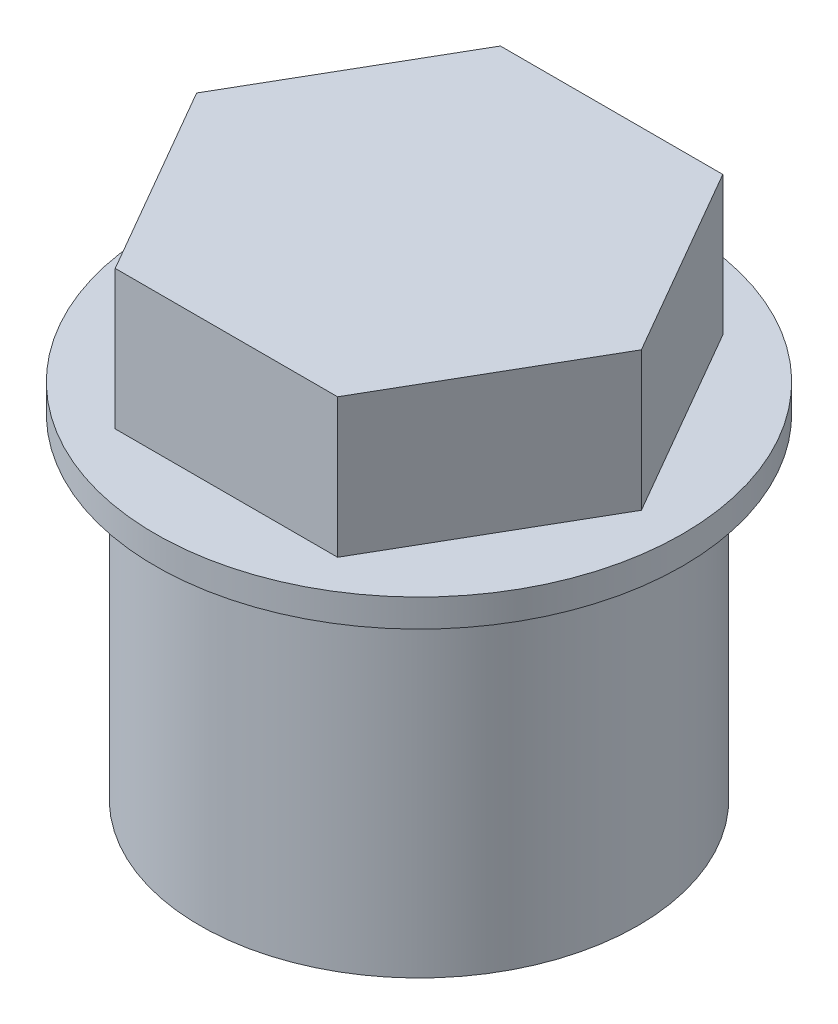
ISO-10303-21;
HEADER;
FILE_DESCRIPTION(('STEP AP214'),'2;1');
FILE_NAME('part.step','',(''),(''),'','','');
FILE_SCHEMA(('AUTOMOTIVE_DESIGN { 1 0 10303 214 1 1 1 1 }'));
ENDSEC;
DATA;
#1=APPLICATION_CONTEXT('core data for automotive mechanical design processes');
#2=APPLICATION_PROTOCOL_DEFINITION('international standard','automotive_design',2000,#1);
#3=PRODUCT_CONTEXT('',#1,'mechanical');
#4=PRODUCT('Part','Part','',(#3));
#5=PRODUCT_RELATED_PRODUCT_CATEGORY('part','',(#4));
#6=PRODUCT_DEFINITION_FORMATION('','',#4);
#7=PRODUCT_DEFINITION_CONTEXT('part definition',#1,'design');
#8=PRODUCT_DEFINITION('design','',#6,#7);
#9=PRODUCT_DEFINITION_SHAPE('','',#8);
#10=(LENGTH_UNIT() NAMED_UNIT(*) SI_UNIT(.MILLI.,.METRE.));
#11=(NAMED_UNIT(*) PLANE_ANGLE_UNIT() SI_UNIT($,.RADIAN.));
#12=(NAMED_UNIT(*) SI_UNIT($,.STERADIAN.) SOLID_ANGLE_UNIT());
#13=UNCERTAINTY_MEASURE_WITH_UNIT(LENGTH_MEASURE(1.E-05),#10,'distance_accuracy_value','');
#14=(GEOMETRIC_REPRESENTATION_CONTEXT(3) GLOBAL_UNCERTAINTY_ASSIGNED_CONTEXT((#13)) GLOBAL_UNIT_ASSIGNED_CONTEXT((#10,
#11,#12)) REPRESENTATION_CONTEXT('',''));
#15=CARTESIAN_POINT('',(0.,0.,0.));
#16=DIRECTION('',(0.,0.,1.));
#17=DIRECTION('',(1.,0.,0.));
#18=AXIS2_PLACEMENT_3D('',#15,#16,#17);
#19=CARTESIAN_POINT('',(10.16,22.86,0.));
#20=DIRECTION('',(0.,1.,0.));
#21=DIRECTION('',(-1.,0.,0.));
#22=AXIS2_PLACEMENT_3D('',#19,#20,#21);
#23=PLANE('',#22);
#24=DIRECTION('',(0.500000000000001,0.,0.866025403784438));
#25=VECTOR('',#24,1.);
#26=CARTESIAN_POINT('',(-7.62,22.86,4.39940905122495));
#27=LINE('',#26,#25);
#28=CARTESIAN_POINT('',(-10.16,22.86,0.));
#29=VERTEX_POINT('',#28);
#30=CARTESIAN_POINT('',(-5.08,22.86,8.7988181024499));
#31=VERTEX_POINT('',#30);
#32=EDGE_CURVE('E101',#29,#31,#27,.T.);
#33=ORIENTED_EDGE('',*,*,#32,.T.);
#34=DIRECTION('',(1.,0.,0.));
#35=VECTOR('',#34,1.);
#36=CARTESIAN_POINT('',(0.,22.86,8.7988181024499));
#37=LINE('',#36,#35);
#38=CARTESIAN_POINT('',(5.08,22.86,8.7988181024499));
#39=VERTEX_POINT('',#38);
#40=EDGE_CURVE('E86',#31,#39,#37,.T.);
#41=ORIENTED_EDGE('',*,*,#40,.T.);
#42=DIRECTION('',(0.5,0.,-0.866025403784439));
#43=VECTOR('',#42,1.);
#44=CARTESIAN_POINT('',(7.62000000000001,22.86,4.39940905122494));
#45=LINE('',#44,#43);
#46=CARTESIAN_POINT('',(10.16,22.86,0.));
#47=VERTEX_POINT('',#46);
#48=EDGE_CURVE('E252',#39,#47,#45,.T.);
#49=ORIENTED_EDGE('',*,*,#48,.T.);
#50=DIRECTION('',(-0.5,0.,-0.866025403784439));
#51=VECTOR('',#50,1.);
#52=CARTESIAN_POINT('',(7.62,22.86,-4.39940905122495));
#53=LINE('',#52,#51);
#54=CARTESIAN_POINT('',(5.08,22.86,-8.7988181024499));
#55=VERTEX_POINT('',#54);
#56=EDGE_CURVE('E247',#47,#55,#53,.T.);
#57=ORIENTED_EDGE('',*,*,#56,.T.);
#58=DIRECTION('',(-1.,0.,0.));
#59=VECTOR('',#58,1.);
#60=CARTESIAN_POINT('',(0.,22.86,-8.7988181024499));
#61=LINE('',#60,#59);
#62=CARTESIAN_POINT('',(-5.08000000000001,22.86,-8.79881810244989));
#63=VERTEX_POINT('',#62);
#64=EDGE_CURVE('E116',#55,#63,#61,.T.);
#65=ORIENTED_EDGE('',*,*,#64,.T.);
#66=DIRECTION('',(-0.5,0.,0.866025403784439));
#67=VECTOR('',#66,1.);
#68=CARTESIAN_POINT('',(-7.62,22.86,-4.39940905122495));
#69=LINE('',#68,#67);
#70=EDGE_CURVE('E57',#63,#29,#69,.T.);
#71=ORIENTED_EDGE('',*,*,#70,.T.);
#72=EDGE_LOOP('',(#33,#41,#49,#57,#65,#71));
#73=FACE_BOUND('',#72,.T.);
#74=ADVANCED_FACE('F34',(#73),#23,.T.);
#75=CARTESIAN_POINT('',(10.0076,0.,0.));
#76=DIRECTION('',(0.,-1.,0.));
#77=DIRECTION('',(1.,0.,0.));
#78=AXIS2_PLACEMENT_3D('',#75,#76,#77);
#79=PLANE('',#78);
#80=CARTESIAN_POINT('',(0.,0.,0.));
#81=DIRECTION('',(0.,-1.,0.));
#82=DIRECTION('',(1.,0.,0.));
#83=AXIS2_PLACEMENT_3D('',#80,#81,#82);
#84=CIRCLE('',#83,10.0076);
#85=CARTESIAN_POINT('',(10.0076,0.,0.));
#86=VERTEX_POINT('',#85);
#87=EDGE_CURVE('E120',#86,#86,#84,.T.);
#88=ORIENTED_EDGE('',*,*,#87,.T.);
#89=EDGE_LOOP('',(#88));
#90=FACE_BOUND('',#89,.T.);
#91=ADVANCED_FACE('F36',(#90),#79,.T.);
#92=CARTESIAN_POINT('',(12.0396,16.51,0.));
#93=DIRECTION('',(0.,1.,0.));
#94=DIRECTION('',(-1.,0.,0.));
#95=AXIS2_PLACEMENT_3D('',#92,#93,#94);
#96=PLANE('',#95);
#97=DIRECTION('',(1.,0.,0.));
#98=VECTOR('',#97,1.);
#99=CARTESIAN_POINT('',(0.,16.51,-8.7988181024499));
#100=LINE('',#99,#98);
#101=CARTESIAN_POINT('',(-5.08000000000001,16.51,-8.79881810244989));
#102=VERTEX_POINT('',#101);
#103=CARTESIAN_POINT('',(5.08,16.51,-8.7988181024499));
#104=VERTEX_POINT('',#103);
#105=EDGE_CURVE('E107',#102,#104,#100,.T.);
#106=ORIENTED_EDGE('',*,*,#105,.T.);
#107=DIRECTION('',(0.5,0.,0.866025403784439));
#108=VECTOR('',#107,1.);
#109=CARTESIAN_POINT('',(7.62,16.51,-4.39940905122495));
#110=LINE('',#109,#108);
#111=CARTESIAN_POINT('',(10.16,16.51,0.));
#112=VERTEX_POINT('',#111);
#113=EDGE_CURVE('E249',#104,#112,#110,.T.);
#114=ORIENTED_EDGE('',*,*,#113,.T.);
#115=DIRECTION('',(-0.5,0.,0.866025403784439));
#116=VECTOR('',#115,1.);
#117=CARTESIAN_POINT('',(7.62,16.51,4.39940905122494));
#118=LINE('',#117,#116);
#119=CARTESIAN_POINT('',(5.08,16.51,8.7988181024499));
#120=VERTEX_POINT('',#119);
#121=EDGE_CURVE('E118',#112,#120,#118,.T.);
#122=ORIENTED_EDGE('',*,*,#121,.T.);
#123=DIRECTION('',(-1.,0.,0.));
#124=VECTOR('',#123,1.);
#125=CARTESIAN_POINT('',(0.,16.51,8.7988181024499));
#126=LINE('',#125,#124);
#127=CARTESIAN_POINT('',(-5.08,16.51,8.7988181024499));
#128=VERTEX_POINT('',#127);
#129=EDGE_CURVE('E49',#120,#128,#126,.T.);
#130=ORIENTED_EDGE('',*,*,#129,.T.);
#131=DIRECTION('',(-0.500000000000001,0.,-0.866025403784438));
#132=VECTOR('',#131,1.);
#133=CARTESIAN_POINT('',(-7.62,16.51,4.39940905122495));
#134=LINE('',#133,#132);
#135=CARTESIAN_POINT('',(-10.16,16.51,0.));
#136=VERTEX_POINT('',#135);
#137=EDGE_CURVE('E103',#128,#136,#134,.T.);
#138=ORIENTED_EDGE('',*,*,#137,.T.);
#139=DIRECTION('',(0.5,0.,-0.866025403784439));
#140=VECTOR('',#139,1.);
#141=CARTESIAN_POINT('',(-7.62000000000001,16.51,-4.39940905122495));
#142=LINE('',#141,#140);
#143=EDGE_CURVE('E256',#136,#102,#142,.T.);
#144=ORIENTED_EDGE('',*,*,#143,.T.);
#145=EDGE_LOOP('',(#106,#114,#122,#130,#138,#144));
#146=FACE_BOUND('',#145,.T.);
#147=CARTESIAN_POINT('',(0.,16.51,0.));
#148=DIRECTION('',(0.,-1.,0.));
#149=DIRECTION('',(1.,0.,0.));
#150=AXIS2_PLACEMENT_3D('',#147,#148,#149);
#151=CIRCLE('',#150,12.0396);
#152=CARTESIAN_POINT('',(12.0396,16.51,0.));
#153=VERTEX_POINT('',#152);
#154=EDGE_CURVE('E11',#153,#153,#151,.T.);
#155=ORIENTED_EDGE('',*,*,#154,.F.);
#156=EDGE_LOOP('',(#155));
#157=FACE_BOUND('',#156,.T.);
#158=ADVANCED_FACE('F133',(#146,#157),#96,.T.);
#159=CARTESIAN_POINT('',(0.,0.,0.));
#160=DIRECTION('',(0.,-1.,0.));
#161=DIRECTION('',(1.,0.,0.));
#162=AXIS2_PLACEMENT_3D('',#159,#160,#161);
#163=CYLINDRICAL_SURFACE('',#162,12.0396);
#164=ORIENTED_EDGE('',*,*,#154,.T.);
#165=EDGE_LOOP('',(#164));
#166=FACE_BOUND('',#165,.T.);
#167=CARTESIAN_POINT('',(0.,15.24,0.));
#168=DIRECTION('',(0.,-1.,0.));
#169=DIRECTION('',(1.,0.,0.));
#170=AXIS2_PLACEMENT_3D('',#167,#168,#169);
#171=CIRCLE('',#170,12.0396);
#172=CARTESIAN_POINT('',(12.0396,15.24,0.));
#173=VERTEX_POINT('',#172);
#174=EDGE_CURVE('E42',#173,#173,#171,.T.);
#175=ORIENTED_EDGE('',*,*,#174,.F.);
#176=EDGE_LOOP('',(#175));
#177=FACE_BOUND('',#176,.T.);
#178=ADVANCED_FACE('F131',(#166,#177),#163,.T.);
#179=CARTESIAN_POINT('',(12.0396,15.24,0.));
#180=DIRECTION('',(0.,-1.,0.));
#181=DIRECTION('',(1.,0.,0.));
#182=AXIS2_PLACEMENT_3D('',#179,#180,#181);
#183=PLANE('',#182);
#184=ORIENTED_EDGE('',*,*,#174,.T.);
#185=EDGE_LOOP('',(#184));
#186=FACE_BOUND('',#185,.T.);
#187=CARTESIAN_POINT('',(0.,15.24,0.));
#188=DIRECTION('',(0.,-1.,0.));
#189=DIRECTION('',(1.,0.,0.));
#190=AXIS2_PLACEMENT_3D('',#187,#188,#189);
#191=CIRCLE('',#190,10.0076);
#192=CARTESIAN_POINT('',(10.0076,15.24,0.));
#193=VERTEX_POINT('',#192);
#194=EDGE_CURVE('E123',#193,#193,#191,.T.);
#195=ORIENTED_EDGE('',*,*,#194,.F.);
#196=EDGE_LOOP('',(#195));
#197=FACE_BOUND('',#196,.T.);
#198=ADVANCED_FACE('F128',(#186,#197),#183,.T.);
#199=CARTESIAN_POINT('',(0.,0.,0.));
#200=DIRECTION('',(0.,-1.,0.));
#201=DIRECTION('',(1.,0.,0.));
#202=AXIS2_PLACEMENT_3D('',#199,#200,#201);
#203=CYLINDRICAL_SURFACE('',#202,10.0076);
#204=ORIENTED_EDGE('',*,*,#194,.T.);
#205=EDGE_LOOP('',(#204));
#206=FACE_BOUND('',#205,.T.);
#207=ORIENTED_EDGE('',*,*,#87,.F.);
#208=EDGE_LOOP('',(#207));
#209=FACE_BOUND('',#208,.T.);
#210=ADVANCED_FACE('F140',(#206,#209),#203,.T.);
#211=CARTESIAN_POINT('',(-7.62,6.25922363144047,4.39940905122495));
#212=DIRECTION('',(-0.866025403784438,0.,0.500000000000001));
#213=DIRECTION('',(0.500000000000001,0.,0.866025403784438));
#214=AXIS2_PLACEMENT_3D('',#211,#212,#213);
#215=PLANE('',#214);
#216=DIRECTION('',(0.,1.,0.));
#217=VECTOR('',#216,1.);
#218=CARTESIAN_POINT('',(-5.08,6.25922363144047,8.7988181024499));
#219=LINE('',#218,#217);
#220=EDGE_CURVE('E89',#128,#31,#219,.T.);
#221=ORIENTED_EDGE('',*,*,#220,.T.);
#222=ORIENTED_EDGE('',*,*,#32,.F.);
#223=DIRECTION('',(0.,1.,0.));
#224=VECTOR('',#223,1.);
#225=CARTESIAN_POINT('',(-10.16,6.25922363144047,0.));
#226=LINE('',#225,#224);
#227=EDGE_CURVE('E104',#136,#29,#226,.T.);
#228=ORIENTED_EDGE('',*,*,#227,.F.);
#229=ORIENTED_EDGE('',*,*,#137,.F.);
#230=EDGE_LOOP('',(#221,#222,#228,#229));
#231=FACE_BOUND('',#230,.T.);
#232=ADVANCED_FACE('F99',(#231),#215,.T.);
#233=CARTESIAN_POINT('',(0.,6.25922363144047,-8.7988181024499));
#234=DIRECTION('',(0.,0.,-1.));
#235=DIRECTION('',(-1.,0.,0.));
#236=AXIS2_PLACEMENT_3D('',#233,#234,#235);
#237=PLANE('',#236);
#238=DIRECTION('',(0.,1.,0.));
#239=VECTOR('',#238,1.);
#240=CARTESIAN_POINT('',(-5.08000000000001,6.25922363144047,-8.79881810244989));
#241=LINE('',#240,#239);
#242=EDGE_CURVE('E255',#102,#63,#241,.T.);
#243=ORIENTED_EDGE('',*,*,#242,.T.);
#244=ORIENTED_EDGE('',*,*,#64,.F.);
#245=DIRECTION('',(0.,1.,0.));
#246=VECTOR('',#245,1.);
#247=CARTESIAN_POINT('',(5.08,6.25922363144047,-8.7988181024499));
#248=LINE('',#247,#246);
#249=EDGE_CURVE('E111',#104,#55,#248,.T.);
#250=ORIENTED_EDGE('',*,*,#249,.F.);
#251=ORIENTED_EDGE('',*,*,#105,.F.);
#252=EDGE_LOOP('',(#243,#244,#250,#251));
#253=FACE_BOUND('',#252,.T.);
#254=ADVANCED_FACE('F159',(#253),#237,.T.);
#255=CARTESIAN_POINT('',(7.62,6.25922363144047,4.39940905122494));
#256=DIRECTION('',(0.866025403784439,0.,0.499999999999999));
#257=DIRECTION('',(0.5,0.,-0.866025403784439));
#258=AXIS2_PLACEMENT_3D('',#255,#256,#257);
#259=PLANE('',#258);
#260=DIRECTION('',(0.,1.,0.));
#261=VECTOR('',#260,1.);
#262=CARTESIAN_POINT('',(10.16,6.25922363144047,0.));
#263=LINE('',#262,#261);
#264=EDGE_CURVE('E253',#112,#47,#263,.T.);
#265=ORIENTED_EDGE('',*,*,#264,.T.);
#266=ORIENTED_EDGE('',*,*,#48,.F.);
#267=DIRECTION('',(0.,1.,0.));
#268=VECTOR('',#267,1.);
#269=CARTESIAN_POINT('',(5.07999999999999,6.25922363144047,8.7988181024499));
#270=LINE('',#269,#268);
#271=EDGE_CURVE('E91',#120,#39,#270,.T.);
#272=ORIENTED_EDGE('',*,*,#271,.F.);
#273=ORIENTED_EDGE('',*,*,#121,.F.);
#274=EDGE_LOOP('',(#265,#266,#272,#273));
#275=FACE_BOUND('',#274,.T.);
#276=ADVANCED_FACE('F163',(#275),#259,.T.);
#277=CARTESIAN_POINT('',(-7.62000000000001,6.25922363144047,-4.39940905122495));
#278=DIRECTION('',(-0.866025403784439,0.,-0.5));
#279=DIRECTION('',(-0.5,0.,0.866025403784439));
#280=AXIS2_PLACEMENT_3D('',#277,#278,#279);
#281=PLANE('',#280);
#282=ORIENTED_EDGE('',*,*,#227,.T.);
#283=ORIENTED_EDGE('',*,*,#70,.F.);
#284=ORIENTED_EDGE('',*,*,#242,.F.);
#285=ORIENTED_EDGE('',*,*,#143,.F.);
#286=EDGE_LOOP('',(#282,#283,#284,#285));
#287=FACE_BOUND('',#286,.T.);
#288=ADVANCED_FACE('F168',(#287),#281,.T.);
#289=CARTESIAN_POINT('',(7.62,6.25922363144047,-4.39940905122495));
#290=DIRECTION('',(0.866025403784439,0.,-0.5));
#291=DIRECTION('',(-0.5,0.,-0.866025403784439));
#292=AXIS2_PLACEMENT_3D('',#289,#290,#291);
#293=PLANE('',#292);
#294=ORIENTED_EDGE('',*,*,#249,.T.);
#295=ORIENTED_EDGE('',*,*,#56,.F.);
#296=ORIENTED_EDGE('',*,*,#264,.F.);
#297=ORIENTED_EDGE('',*,*,#113,.F.);
#298=EDGE_LOOP('',(#294,#295,#296,#297));
#299=FACE_BOUND('',#298,.T.);
#300=ADVANCED_FACE('F172',(#299),#293,.T.);
#301=CARTESIAN_POINT('',(0.,6.25922363144047,8.7988181024499));
#302=DIRECTION('',(0.,0.,1.));
#303=DIRECTION('',(1.,0.,0.));
#304=AXIS2_PLACEMENT_3D('',#301,#302,#303);
#305=PLANE('',#304);
#306=ORIENTED_EDGE('',*,*,#271,.T.);
#307=ORIENTED_EDGE('',*,*,#40,.F.);
#308=ORIENTED_EDGE('',*,*,#220,.F.);
#309=ORIENTED_EDGE('',*,*,#129,.F.);
#310=EDGE_LOOP('',(#306,#307,#308,#309));
#311=FACE_BOUND('',#310,.T.);
#312=ADVANCED_FACE('F88',(#311),#305,.T.);
#313=CLOSED_SHELL('',(#74,#91,#158,#178,#198,#210,#232,#254,#276,#288,#300,#312));
#314=MANIFOLD_SOLID_BREP('B2',#313);
#315=ADVANCED_BREP_SHAPE_REPRESENTATION('',(#18,#314),#14);
#316=SHAPE_DEFINITION_REPRESENTATION(#9,#315);
ENDSEC;
END-ISO-10303-21;
